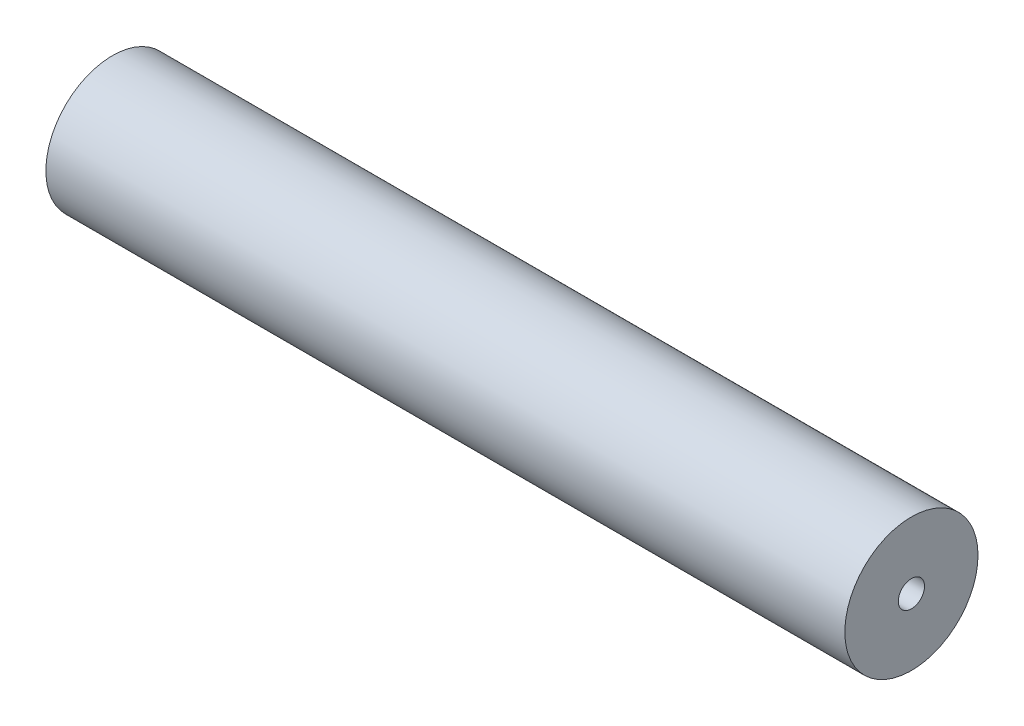
ISO-10303-21;
HEADER;
FILE_DESCRIPTION(('STEP AP214'),'2;1');
FILE_NAME('part.step','',(''),(''),'','','');
FILE_SCHEMA(('AUTOMOTIVE_DESIGN { 1 0 10303 214 1 1 1 1 }'));
ENDSEC;
DATA;
#1=APPLICATION_CONTEXT('core data for automotive mechanical design processes');
#2=APPLICATION_PROTOCOL_DEFINITION('international standard','automotive_design',2000,#1);
#3=PRODUCT_CONTEXT('',#1,'mechanical');
#4=PRODUCT('Part','Part','',(#3));
#5=PRODUCT_RELATED_PRODUCT_CATEGORY('part','',(#4));
#6=PRODUCT_DEFINITION_FORMATION('','',#4);
#7=PRODUCT_DEFINITION_CONTEXT('part definition',#1,'design');
#8=PRODUCT_DEFINITION('design','',#6,#7);
#9=PRODUCT_DEFINITION_SHAPE('','',#8);
#10=(LENGTH_UNIT() NAMED_UNIT(*) SI_UNIT(.MILLI.,.METRE.));
#11=(NAMED_UNIT(*) PLANE_ANGLE_UNIT() SI_UNIT($,.RADIAN.));
#12=(NAMED_UNIT(*) SI_UNIT($,.STERADIAN.) SOLID_ANGLE_UNIT());
#13=UNCERTAINTY_MEASURE_WITH_UNIT(LENGTH_MEASURE(1.E-05),#10,'distance_accuracy_value','');
#14=(GEOMETRIC_REPRESENTATION_CONTEXT(3) GLOBAL_UNCERTAINTY_ASSIGNED_CONTEXT((#13)) GLOBAL_UNIT_ASSIGNED_CONTEXT((#10,
#11,#12)) REPRESENTATION_CONTEXT('',''));
#15=CARTESIAN_POINT('',(0.,0.,0.));
#16=DIRECTION('',(0.,0.,1.));
#17=DIRECTION('',(1.,0.,0.));
#18=AXIS2_PLACEMENT_3D('',#15,#16,#17);
#19=CARTESIAN_POINT('',(457.2,0.,0.));
#20=DIRECTION('',(-1.,0.,0.));
#21=DIRECTION('',(0.,0.,1.));
#22=AXIS2_PLACEMENT_3D('',#19,#20,#21);
#23=CYLINDRICAL_SURFACE('',#22,38.1);
#24=CARTESIAN_POINT('',(457.2,0.,0.));
#25=DIRECTION('',(1.,0.,0.));
#26=DIRECTION('',(0.,0.,-1.));
#27=AXIS2_PLACEMENT_3D('',#24,#25,#26);
#28=CIRCLE('',#27,38.1);
#29=CARTESIAN_POINT('',(457.2,0.,-38.1));
#30=VERTEX_POINT('',#29);
#31=EDGE_CURVE('E11',#30,#30,#28,.T.);
#32=ORIENTED_EDGE('',*,*,#31,.F.);
#33=EDGE_LOOP('',(#32));
#34=FACE_BOUND('',#33,.T.);
#35=CARTESIAN_POINT('',(0.,0.,0.));
#36=DIRECTION('',(1.,0.,0.));
#37=DIRECTION('',(0.,0.,-1.));
#38=AXIS2_PLACEMENT_3D('',#35,#36,#37);
#39=CIRCLE('',#38,38.1);
#40=CARTESIAN_POINT('',(0.,0.,-38.1));
#41=VERTEX_POINT('',#40);
#42=EDGE_CURVE('E46',#41,#41,#39,.T.);
#43=ORIENTED_EDGE('',*,*,#42,.T.);
#44=EDGE_LOOP('',(#43));
#45=FACE_BOUND('',#44,.T.);
#46=ADVANCED_FACE('F43',(#34,#45),#23,.T.);
#47=CARTESIAN_POINT('',(457.2,0.,0.));
#48=DIRECTION('',(1.,0.,0.));
#49=DIRECTION('',(0.,0.,-1.));
#50=AXIS2_PLACEMENT_3D('',#47,#48,#49);
#51=PLANE('',#50);
#52=CARTESIAN_POINT('',(457.2,0.,0.));
#53=DIRECTION('',(1.,0.,0.));
#54=DIRECTION('',(0.,0.,-1.));
#55=AXIS2_PLACEMENT_3D('',#52,#53,#54);
#56=CIRCLE('',#55,7.49999999999999);
#57=CARTESIAN_POINT('',(457.2,0.,-7.49999999999999));
#58=VERTEX_POINT('',#57);
#59=EDGE_CURVE('E69',#58,#58,#56,.T.);
#60=ORIENTED_EDGE('',*,*,#59,.F.);
#61=EDGE_LOOP('',(#60));
#62=FACE_BOUND('',#61,.T.);
#63=ORIENTED_EDGE('',*,*,#31,.T.);
#64=EDGE_LOOP('',(#63));
#65=FACE_BOUND('',#64,.T.);
#66=ADVANCED_FACE('F95',(#62,#65),#51,.T.);
#67=CARTESIAN_POINT('',(0.,0.,0.));
#68=DIRECTION('',(1.,0.,0.));
#69=DIRECTION('',(0.,0.,-1.));
#70=AXIS2_PLACEMENT_3D('',#67,#68,#69);
#71=PLANE('',#70);
#72=CARTESIAN_POINT('',(0.,0.,0.));
#73=DIRECTION('',(-1.,0.,0.));
#74=DIRECTION('',(0.,0.,1.));
#75=AXIS2_PLACEMENT_3D('',#72,#73,#74);
#76=CIRCLE('',#75,6.775);
#77=CARTESIAN_POINT('',(0.,0.,6.775));
#78=VERTEX_POINT('',#77);
#79=EDGE_CURVE('E68',#78,#78,#76,.T.);
#80=ORIENTED_EDGE('',*,*,#79,.F.);
#81=EDGE_LOOP('',(#80));
#82=FACE_BOUND('',#81,.T.);
#83=ORIENTED_EDGE('',*,*,#42,.F.);
#84=EDGE_LOOP('',(#83));
#85=FACE_BOUND('',#84,.T.);
#86=ADVANCED_FACE('F92',(#82,#85),#71,.F.);
#87=CARTESIAN_POINT('',(21.344190821564,0.,0.));
#88=DIRECTION('',(-1.,0.,0.));
#89=DIRECTION('',(0.,0.,1.));
#90=AXIS2_PLACEMENT_3D('',#87,#88,#89);
#91=CONICAL_SURFACE('',#90,6.74999999999999,1.02974425867665);
#92=CARTESIAN_POINT('',(25.4,0.,0.));
#93=VERTEX_POINT('',#92);
#94=VERTEX_LOOP('',#93);
#95=FACE_BOUND('',#94,.T.);
#96=CARTESIAN_POINT('',(21.344190821564,0.,0.));
#97=DIRECTION('',(-1.,0.,0.));
#98=DIRECTION('',(0.,0.,1.));
#99=AXIS2_PLACEMENT_3D('',#96,#97,#98);
#100=CIRCLE('',#99,6.74999999999999);
#101=CARTESIAN_POINT('',(21.344190821564,0.,6.74999999999999));
#102=VERTEX_POINT('',#101);
#103=EDGE_CURVE('E82',#102,#102,#100,.T.);
#104=ORIENTED_EDGE('',*,*,#103,.T.);
#105=EDGE_LOOP('',(#104));
#106=FACE_BOUND('',#105,.T.);
#107=ADVANCED_FACE('F94',(#95,#106),#91,.F.);
#108=CARTESIAN_POINT('',(0.,0.,0.));
#109=DIRECTION('',(-1.,0.,0.));
#110=DIRECTION('',(0.,0.,1.));
#111=AXIS2_PLACEMENT_3D('',#108,#109,#110);
#112=CYLINDRICAL_SURFACE('',#111,6.75);
#113=ORIENTED_EDGE('',*,*,#103,.F.);
#114=EDGE_LOOP('',(#113));
#115=FACE_BOUND('',#114,.T.);
#116=CARTESIAN_POINT('',(0.0250000000000042,0.,0.));
#117=DIRECTION('',(-1.,0.,0.));
#118=DIRECTION('',(0.,0.,1.));
#119=AXIS2_PLACEMENT_3D('',#116,#117,#118);
#120=CIRCLE('',#119,6.75);
#121=CARTESIAN_POINT('',(0.0250000000000042,0.,6.75));
#122=VERTEX_POINT('',#121);
#123=EDGE_CURVE('E74',#122,#122,#120,.T.);
#124=ORIENTED_EDGE('',*,*,#123,.T.);
#125=EDGE_LOOP('',(#124));
#126=FACE_BOUND('',#125,.T.);
#127=ADVANCED_FACE('F101',(#115,#126),#112,.F.);
#128=CARTESIAN_POINT('',(0.,0.,0.));
#129=DIRECTION('',(-1.,0.,0.));
#130=DIRECTION('',(0.,0.,1.));
#131=AXIS2_PLACEMENT_3D('',#128,#129,#130);
#132=CONICAL_SURFACE('',#131,6.775,0.785398163397396);
#133=ORIENTED_EDGE('',*,*,#123,.F.);
#134=EDGE_LOOP('',(#133));
#135=FACE_BOUND('',#134,.T.);
#136=ORIENTED_EDGE('',*,*,#79,.T.);
#137=EDGE_LOOP('',(#136));
#138=FACE_BOUND('',#137,.T.);
#139=ADVANCED_FACE('F61',(#135,#138),#132,.F.);
#140=CARTESIAN_POINT('',(436.306454642707,0.,0.));
#141=DIRECTION('',(1.,0.,0.));
#142=DIRECTION('',(0.,0.,-1.));
#143=AXIS2_PLACEMENT_3D('',#140,#141,#142);
#144=CONICAL_SURFACE('',#143,7.49999999999999,1.02974425867666);
#145=CARTESIAN_POINT('',(431.8,0.,0.));
#146=VERTEX_POINT('',#145);
#147=VERTEX_LOOP('',#146);
#148=FACE_BOUND('',#147,.T.);
#149=CARTESIAN_POINT('',(436.306454642707,0.,0.));
#150=DIRECTION('',(1.,0.,0.));
#151=DIRECTION('',(0.,0.,-1.));
#152=AXIS2_PLACEMENT_3D('',#149,#150,#151);
#153=CIRCLE('',#152,7.49999999999999);
#154=CARTESIAN_POINT('',(436.306454642707,0.,-7.49999999999999));
#155=VERTEX_POINT('',#154);
#156=EDGE_CURVE('E65',#155,#155,#153,.T.);
#157=ORIENTED_EDGE('',*,*,#156,.T.);
#158=EDGE_LOOP('',(#157));
#159=FACE_BOUND('',#158,.T.);
#160=ADVANCED_FACE('F57',(#148,#159),#144,.F.);
#161=CARTESIAN_POINT('',(457.2,0.,0.));
#162=DIRECTION('',(1.,0.,0.));
#163=DIRECTION('',(0.,0.,-1.));
#164=AXIS2_PLACEMENT_3D('',#161,#162,#163);
#165=CYLINDRICAL_SURFACE('',#164,7.49999999999999);
#166=ORIENTED_EDGE('',*,*,#156,.F.);
#167=EDGE_LOOP('',(#166));
#168=FACE_BOUND('',#167,.T.);
#169=ORIENTED_EDGE('',*,*,#59,.T.);
#170=EDGE_LOOP('',(#169));
#171=FACE_BOUND('',#170,.T.);
#172=ADVANCED_FACE('F60',(#168,#171),#165,.F.);
#173=CLOSED_SHELL('',(#46,#66,#86,#107,#127,#139,#160,#172));
#174=MANIFOLD_SOLID_BREP('B2',#173);
#175=ADVANCED_BREP_SHAPE_REPRESENTATION('',(#18,#174),#14);
#176=SHAPE_DEFINITION_REPRESENTATION(#9,#175);
ENDSEC;
END-ISO-10303-21;
